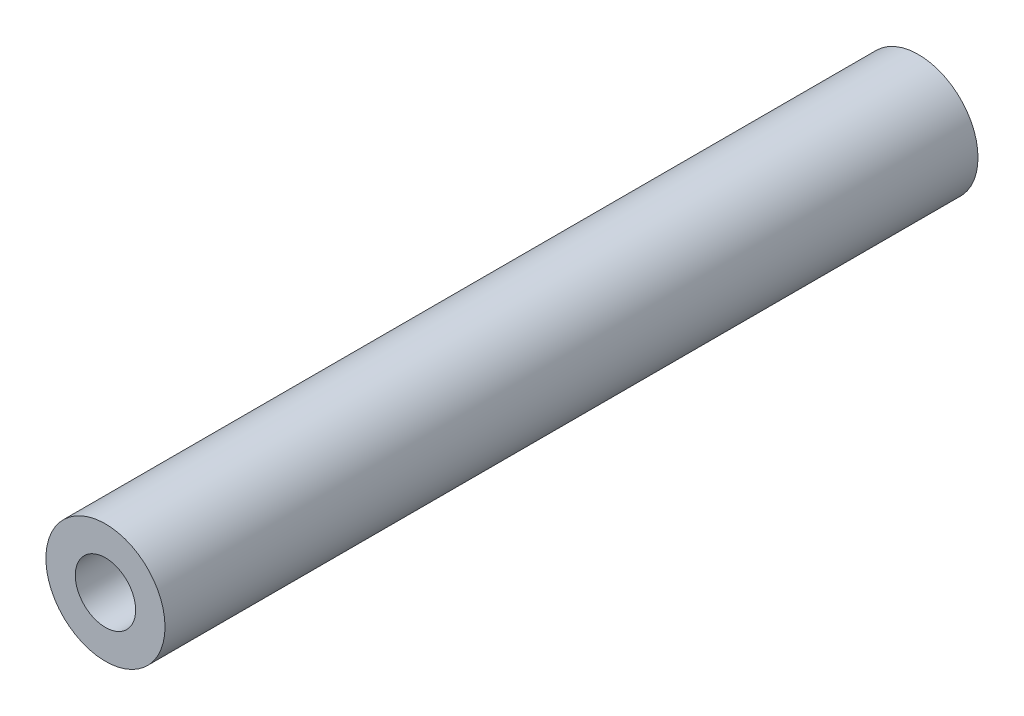
ISO-10303-21;
HEADER;
FILE_DESCRIPTION(('STEP AP214'),'2;1');
FILE_NAME('part.step','',(''),(''),'','','');
FILE_SCHEMA(('AUTOMOTIVE_DESIGN { 1 0 10303 214 1 1 1 1 }'));
ENDSEC;
DATA;
#1=APPLICATION_CONTEXT('core data for automotive mechanical design processes');
#2=APPLICATION_PROTOCOL_DEFINITION('international standard','automotive_design',2000,#1);
#3=PRODUCT_CONTEXT('',#1,'mechanical');
#4=PRODUCT('Part','Part','',(#3));
#5=PRODUCT_RELATED_PRODUCT_CATEGORY('part','',(#4));
#6=PRODUCT_DEFINITION_FORMATION('','',#4);
#7=PRODUCT_DEFINITION_CONTEXT('part definition',#1,'design');
#8=PRODUCT_DEFINITION('design','',#6,#7);
#9=PRODUCT_DEFINITION_SHAPE('','',#8);
#10=(LENGTH_UNIT() NAMED_UNIT(*) SI_UNIT(.MILLI.,.METRE.));
#11=(NAMED_UNIT(*) PLANE_ANGLE_UNIT() SI_UNIT($,.RADIAN.));
#12=(NAMED_UNIT(*) SI_UNIT($,.STERADIAN.) SOLID_ANGLE_UNIT());
#13=UNCERTAINTY_MEASURE_WITH_UNIT(LENGTH_MEASURE(1.E-05),#10,'distance_accuracy_value','');
#14=(GEOMETRIC_REPRESENTATION_CONTEXT(3) GLOBAL_UNCERTAINTY_ASSIGNED_CONTEXT((#13)) GLOBAL_UNIT_ASSIGNED_CONTEXT((#10,
#11,#12)) REPRESENTATION_CONTEXT('',''));
#15=CARTESIAN_POINT('',(0.,0.,0.));
#16=DIRECTION('',(0.,0.,1.));
#17=DIRECTION('',(1.,0.,0.));
#18=AXIS2_PLACEMENT_3D('',#15,#16,#17);
#19=CARTESIAN_POINT('',(0.,0.,13.3477));
#20=DIRECTION('',(0.,0.,1.));
#21=DIRECTION('',(1.,0.,0.));
#22=AXIS2_PLACEMENT_3D('',#19,#20,#21);
#23=PLANE('',#22);
#24=CARTESIAN_POINT('',(0.,0.,13.3477));
#25=DIRECTION('',(0.,0.,1.));
#26=DIRECTION('',(1.,0.,0.));
#27=AXIS2_PLACEMENT_3D('',#24,#25,#26);
#28=CIRCLE('',#27,1.9558);
#29=CARTESIAN_POINT('',(1.9558,0.,13.3477));
#30=VERTEX_POINT('',#29);
#31=EDGE_CURVE('E10',#30,#30,#28,.T.);
#32=ORIENTED_EDGE('',*,*,#31,.T.);
#33=EDGE_LOOP('',(#32));
#34=FACE_BOUND('',#33,.T.);
#35=CARTESIAN_POINT('',(0.,0.,13.3477));
#36=DIRECTION('',(0.,0.,1.));
#37=DIRECTION('',(1.,0.,0.));
#38=AXIS2_PLACEMENT_3D('',#35,#36,#37);
#39=CIRCLE('',#38,0.9906);
#40=CARTESIAN_POINT('',(0.9906,0.,13.3477));
#41=VERTEX_POINT('',#40);
#42=EDGE_CURVE('E42',#41,#41,#39,.T.);
#43=ORIENTED_EDGE('',*,*,#42,.F.);
#44=EDGE_LOOP('',(#43));
#45=FACE_BOUND('',#44,.T.);
#46=ADVANCED_FACE('F31',(#34,#45),#23,.T.);
#47=CARTESIAN_POINT('',(0.,0.,-13.3477));
#48=DIRECTION('',(0.,0.,1.));
#49=DIRECTION('',(1.,0.,0.));
#50=AXIS2_PLACEMENT_3D('',#47,#48,#49);
#51=PLANE('',#50);
#52=CARTESIAN_POINT('',(0.,0.,-13.3477));
#53=DIRECTION('',(0.,0.,1.));
#54=DIRECTION('',(1.,0.,0.));
#55=AXIS2_PLACEMENT_3D('',#52,#53,#54);
#56=CIRCLE('',#55,1.9558);
#57=CARTESIAN_POINT('',(1.9558,0.,-13.3477));
#58=VERTEX_POINT('',#57);
#59=EDGE_CURVE('E35',#58,#58,#56,.T.);
#60=ORIENTED_EDGE('',*,*,#59,.F.);
#61=EDGE_LOOP('',(#60));
#62=FACE_BOUND('',#61,.T.);
#63=CARTESIAN_POINT('',(0.,0.,-13.3477));
#64=DIRECTION('',(0.,0.,1.));
#65=DIRECTION('',(1.,0.,0.));
#66=AXIS2_PLACEMENT_3D('',#63,#64,#65);
#67=CIRCLE('',#66,0.9906);
#68=CARTESIAN_POINT('',(0.9906,0.,-13.3477));
#69=VERTEX_POINT('',#68);
#70=EDGE_CURVE('E44',#69,#69,#67,.T.);
#71=ORIENTED_EDGE('',*,*,#70,.T.);
#72=EDGE_LOOP('',(#71));
#73=FACE_BOUND('',#72,.T.);
#74=ADVANCED_FACE('F54',(#62,#73),#51,.F.);
#75=CARTESIAN_POINT('',(0.,0.,13.3477));
#76=DIRECTION('',(0.,0.,-1.));
#77=DIRECTION('',(-1.,0.,0.));
#78=AXIS2_PLACEMENT_3D('',#75,#76,#77);
#79=CYLINDRICAL_SURFACE('',#78,1.9558);
#80=ORIENTED_EDGE('',*,*,#31,.F.);
#81=EDGE_LOOP('',(#80));
#82=FACE_BOUND('',#81,.T.);
#83=ORIENTED_EDGE('',*,*,#59,.T.);
#84=EDGE_LOOP('',(#83));
#85=FACE_BOUND('',#84,.T.);
#86=ADVANCED_FACE('F33',(#82,#85),#79,.T.);
#87=CARTESIAN_POINT('',(0.,0.,13.3477));
#88=DIRECTION('',(0.,0.,-1.));
#89=DIRECTION('',(-1.,0.,0.));
#90=AXIS2_PLACEMENT_3D('',#87,#88,#89);
#91=CYLINDRICAL_SURFACE('',#90,0.9906);
#92=ORIENTED_EDGE('',*,*,#42,.T.);
#93=EDGE_LOOP('',(#92));
#94=FACE_BOUND('',#93,.T.);
#95=ORIENTED_EDGE('',*,*,#70,.F.);
#96=EDGE_LOOP('',(#95));
#97=FACE_BOUND('',#96,.T.);
#98=ADVANCED_FACE('F50',(#94,#97),#91,.F.);
#99=CLOSED_SHELL('',(#46,#74,#86,#98));
#100=MANIFOLD_SOLID_BREP('B2',#99);
#101=ADVANCED_BREP_SHAPE_REPRESENTATION('',(#18,#100),#14);
#102=SHAPE_DEFINITION_REPRESENTATION(#9,#101);
ENDSEC;
END-ISO-10303-21;
